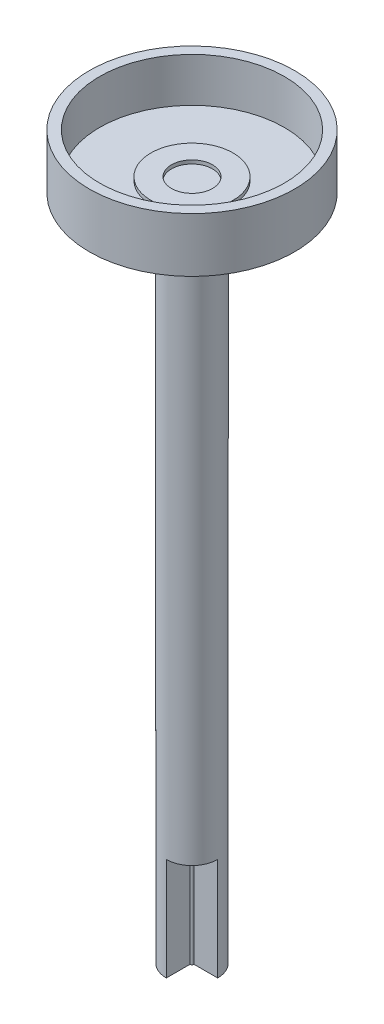
ISO-10303-21;
HEADER;
FILE_DESCRIPTION(('STEP AP214'),'2;1');
FILE_NAME('part.step','',(''),(''),'','','');
FILE_SCHEMA(('AUTOMOTIVE_DESIGN { 1 0 10303 214 1 1 1 1 }'));
ENDSEC;
DATA;
#1=APPLICATION_CONTEXT('core data for automotive mechanical design processes');
#2=APPLICATION_PROTOCOL_DEFINITION('international standard','automotive_design',2000,#1);
#3=PRODUCT_CONTEXT('',#1,'mechanical');
#4=PRODUCT('Part','Part','',(#3));
#5=PRODUCT_RELATED_PRODUCT_CATEGORY('part','',(#4));
#6=PRODUCT_DEFINITION_FORMATION('','',#4);
#7=PRODUCT_DEFINITION_CONTEXT('part definition',#1,'design');
#8=PRODUCT_DEFINITION('design','',#6,#7);
#9=PRODUCT_DEFINITION_SHAPE('','',#8);
#10=(LENGTH_UNIT() NAMED_UNIT(*) SI_UNIT(.MILLI.,.METRE.));
#11=(NAMED_UNIT(*) PLANE_ANGLE_UNIT() SI_UNIT($,.RADIAN.));
#12=(NAMED_UNIT(*) SI_UNIT($,.STERADIAN.) SOLID_ANGLE_UNIT());
#13=UNCERTAINTY_MEASURE_WITH_UNIT(LENGTH_MEASURE(1.E-05),#10,'distance_accuracy_value','');
#14=(GEOMETRIC_REPRESENTATION_CONTEXT(3) GLOBAL_UNCERTAINTY_ASSIGNED_CONTEXT((#13)) GLOBAL_UNIT_ASSIGNED_CONTEXT((#10,
#11,#12)) REPRESENTATION_CONTEXT('',''));
#15=CARTESIAN_POINT('',(0.,0.,0.));
#16=DIRECTION('',(0.,0.,1.));
#17=DIRECTION('',(1.,0.,0.));
#18=AXIS2_PLACEMENT_3D('',#15,#16,#17);
#19=CARTESIAN_POINT('',(0.,4.3,0.));
#20=DIRECTION('',(0.,1.,0.));
#21=DIRECTION('',(0.,0.,1.));
#22=AXIS2_PLACEMENT_3D('',#19,#20,#21);
#23=PLANE('',#22);
#24=CARTESIAN_POINT('',(0.,4.3,0.));
#25=DIRECTION('',(0.,1.,0.));
#26=DIRECTION('',(0.,0.,1.));
#27=AXIS2_PLACEMENT_3D('',#24,#25,#26);
#28=CIRCLE('',#27,10.);
#29=CARTESIAN_POINT('',(0.,4.3,-10.));
#30=VERTEX_POINT('',#29);
#31=EDGE_CURVE('E181',#30,#30,#28,.T.);
#32=ORIENTED_EDGE('',*,*,#31,.T.);
#33=EDGE_LOOP('',(#32));
#34=FACE_BOUND('',#33,.T.);
#35=CARTESIAN_POINT('',(0.,4.3,0.));
#36=DIRECTION('',(0.,1.,0.));
#37=DIRECTION('',(0.,0.,1.));
#38=AXIS2_PLACEMENT_3D('',#35,#36,#37);
#39=CIRCLE('',#38,9.);
#40=CARTESIAN_POINT('',(0.,4.3,-9.));
#41=VERTEX_POINT('',#40);
#42=EDGE_CURVE('E178',#41,#41,#39,.T.);
#43=ORIENTED_EDGE('',*,*,#42,.F.);
#44=EDGE_LOOP('',(#43));
#45=FACE_BOUND('',#44,.T.);
#46=ADVANCED_FACE('F38',(#34,#45),#23,.T.);
#47=CARTESIAN_POINT('',(0.,4.3,0.));
#48=DIRECTION('',(0.,-1.,0.));
#49=DIRECTION('',(0.,0.,-1.));
#50=AXIS2_PLACEMENT_3D('',#47,#48,#49);
#51=CYLINDRICAL_SURFACE('',#50,10.);
#52=CARTESIAN_POINT('',(0.,-1.,0.));
#53=DIRECTION('',(0.,1.,0.));
#54=DIRECTION('',(0.,0.,1.));
#55=AXIS2_PLACEMENT_3D('',#52,#53,#54);
#56=CIRCLE('',#55,10.);
#57=CARTESIAN_POINT('',(0.,-1.,-10.));
#58=VERTEX_POINT('',#57);
#59=EDGE_CURVE('E172',#58,#58,#56,.T.);
#60=CARTESIAN_POINT('',(0.,4.3,-10.));
#61=CARTESIAN_POINT('',(0.,4.24479166666667,-10.));
#62=CARTESIAN_POINT('',(0.,4.18958333333333,-10.));
#63=CARTESIAN_POINT('',(0.,4.07916666666667,-10.));
#64=CARTESIAN_POINT('',(0.,4.02395833333333,-10.));
#65=CARTESIAN_POINT('',(0.,3.91354166666667,-10.));
#66=CARTESIAN_POINT('',(0.,3.85833333333333,-10.));
#67=CARTESIAN_POINT('',(0.,3.74791666666667,-10.));
#68=CARTESIAN_POINT('',(0.,3.69270833333333,-10.));
#69=CARTESIAN_POINT('',(0.,3.58229166666667,-10.));
#70=CARTESIAN_POINT('',(0.,3.52708333333333,-10.));
#71=CARTESIAN_POINT('',(0.,3.41666666666667,-10.));
#72=CARTESIAN_POINT('',(0.,3.36145833333333,-10.));
#73=CARTESIAN_POINT('',(0.,3.25104166666667,-10.));
#74=CARTESIAN_POINT('',(0.,3.19583333333333,-10.));
#75=CARTESIAN_POINT('',(0.,3.08541666666667,-10.));
#76=CARTESIAN_POINT('',(0.,3.03020833333333,-10.));
#77=CARTESIAN_POINT('',(0.,2.91979166666667,-10.));
#78=CARTESIAN_POINT('',(0.,2.86458333333333,-10.));
#79=CARTESIAN_POINT('',(0.,2.75416666666667,-10.));
#80=CARTESIAN_POINT('',(0.,2.69895833333333,-10.));
#81=CARTESIAN_POINT('',(0.,2.58854166666667,-10.));
#82=CARTESIAN_POINT('',(0.,2.53333333333333,-10.));
#83=CARTESIAN_POINT('',(0.,2.42291666666667,-10.));
#84=CARTESIAN_POINT('',(0.,2.36770833333333,-10.));
#85=CARTESIAN_POINT('',(0.,2.25729166666667,-10.));
#86=CARTESIAN_POINT('',(0.,2.20208333333333,-10.));
#87=CARTESIAN_POINT('',(0.,2.09166666666667,-10.));
#88=CARTESIAN_POINT('',(0.,2.03645833333333,-10.));
#89=CARTESIAN_POINT('',(0.,1.92604166666667,-10.));
#90=CARTESIAN_POINT('',(0.,1.87083333333333,-10.));
#91=CARTESIAN_POINT('',(0.,1.76041666666667,-10.));
#92=CARTESIAN_POINT('',(0.,1.70520833333333,-10.));
#93=CARTESIAN_POINT('',(0.,1.59479166666667,-10.));
#94=CARTESIAN_POINT('',(0.,1.53958333333333,-10.));
#95=CARTESIAN_POINT('',(0.,1.42916666666667,-10.));
#96=CARTESIAN_POINT('',(0.,1.37395833333333,-10.));
#97=CARTESIAN_POINT('',(0.,1.26354166666667,-10.));
#98=CARTESIAN_POINT('',(0.,1.20833333333333,-10.));
#99=CARTESIAN_POINT('',(0.,1.09791666666667,-10.));
#100=CARTESIAN_POINT('',(0.,1.04270833333333,-10.));
#101=CARTESIAN_POINT('',(0.,0.932291666666666,-10.));
#102=CARTESIAN_POINT('',(0.,0.877083333333333,-10.));
#103=CARTESIAN_POINT('',(0.,0.766666666666666,-10.));
#104=CARTESIAN_POINT('',(0.,0.711458333333333,-10.));
#105=CARTESIAN_POINT('',(0.,0.601041666666666,-10.));
#106=CARTESIAN_POINT('',(0.,0.545833333333333,-10.));
#107=CARTESIAN_POINT('',(0.,0.435416666666666,-10.));
#108=CARTESIAN_POINT('',(0.,0.380208333333333,-10.));
#109=CARTESIAN_POINT('',(0.,0.269791666666666,-10.));
#110=CARTESIAN_POINT('',(0.,0.214583333333333,-10.));
#111=CARTESIAN_POINT('',(0.,0.104166666666666,-10.));
#112=CARTESIAN_POINT('',(0.,0.0489583333333331,-10.));
#113=CARTESIAN_POINT('',(0.,-0.0614583333333335,-10.));
#114=CARTESIAN_POINT('',(0.,-0.116666666666667,-10.));
#115=CARTESIAN_POINT('',(0.,-0.227083333333333,-10.));
#116=CARTESIAN_POINT('',(0.,-0.282291666666667,-10.));
#117=CARTESIAN_POINT('',(0.,-0.392708333333333,-10.));
#118=CARTESIAN_POINT('',(0.,-0.447916666666667,-10.));
#119=CARTESIAN_POINT('',(0.,-0.558333333333333,-10.));
#120=CARTESIAN_POINT('',(0.,-0.613541666666667,-10.));
#121=CARTESIAN_POINT('',(0.,-0.723958333333333,-10.));
#122=CARTESIAN_POINT('',(0.,-0.779166666666667,-10.));
#123=CARTESIAN_POINT('',(0.,-0.889583333333333,-10.));
#124=CARTESIAN_POINT('',(0.,-0.944791666666667,-10.));
#125=CARTESIAN_POINT('',(0.,-1.,-10.));
#126=B_SPLINE_CURVE_WITH_KNOTS('',3,(#60,#61,#62,#63,#64,#65,#66,#67,#68,#69,#70,#71,#72,#73,
#74,#75,#76,#77,#78,#79,#80,#81,#82,#83,#84,#85,#86,#87,#88,#89,#90,#91,#92,#93,#94,#95,#96,#97,
#98,#99,#100,#101,#102,#103,#104,#105,#106,#107,#108,#109,#110,#111,#112,#113,#114,#115,#116,
#117,#118,#119,#120,#121,#122,#123,#124,#125),.UNSPECIFIED.,.F.,.F.,(4,2,2,2,2,2,2,2,2,2,2,2,2,
2,2,2,2,2,2,2,2,2,2,2,2,2,2,2,2,2,2,2,4),(0.,0.165625000000001,0.331250000000001,0.496875,
0.6625,0.828125,0.993750000000001,1.159375,1.325,1.490625,1.65625,1.821875,1.9875,2.153125,
2.31875,2.484375,2.65,2.815625,2.98125,3.146875,3.3125,3.478125,3.64375,3.809375,3.975,4.140625,
4.30625,4.471875,4.6375,4.803125,4.96875,5.134375,5.3),.UNSPECIFIED.);
#127=EDGE_CURVE('BSEAM40',#30,#58,#126,.T.);
#128=ORIENTED_EDGE('',*,*,#31,.F.);
#129=ORIENTED_EDGE('',*,*,#59,.T.);
#130=ORIENTED_EDGE('',*,*,#127,.T.);
#131=ORIENTED_EDGE('',*,*,#127,.F.);
#132=EDGE_LOOP('',(#128,#130,#129,#131));
#133=FACE_BOUND('',#132,.T.);
#134=ADVANCED_FACE('F40',(#133),#51,.T.);
#135=CARTESIAN_POINT('',(0.,4.3,0.));
#136=DIRECTION('',(0.,-1.,0.));
#137=DIRECTION('',(0.,0.,-1.));
#138=AXIS2_PLACEMENT_3D('',#135,#136,#137);
#139=CYLINDRICAL_SURFACE('',#138,9.);
#140=CARTESIAN_POINT('',(0.,0.,0.));
#141=DIRECTION('',(0.,1.,0.));
#142=DIRECTION('',(0.,0.,1.));
#143=AXIS2_PLACEMENT_3D('',#140,#141,#142);
#144=CIRCLE('',#143,9.);
#145=CARTESIAN_POINT('',(0.,0.,-9.));
#146=VERTEX_POINT('',#145);
#147=EDGE_CURVE('E177',#146,#146,#144,.T.);
#148=CARTESIAN_POINT('',(0.,4.3,-9.));
#149=CARTESIAN_POINT('',(0.,4.25520833333333,-9.));
#150=CARTESIAN_POINT('',(0.,4.21041666666667,-9.));
#151=CARTESIAN_POINT('',(0.,4.12083333333333,-9.));
#152=CARTESIAN_POINT('',(0.,4.07604166666667,-9.));
#153=CARTESIAN_POINT('',(0.,3.98645833333333,-9.));
#154=CARTESIAN_POINT('',(0.,3.94166666666667,-9.));
#155=CARTESIAN_POINT('',(0.,3.85208333333333,-9.));
#156=CARTESIAN_POINT('',(0.,3.80729166666667,-9.));
#157=CARTESIAN_POINT('',(0.,3.71770833333333,-9.));
#158=CARTESIAN_POINT('',(0.,3.67291666666667,-9.));
#159=CARTESIAN_POINT('',(0.,3.58333333333333,-9.));
#160=CARTESIAN_POINT('',(0.,3.53854166666667,-9.));
#161=CARTESIAN_POINT('',(0.,3.44895833333333,-9.));
#162=CARTESIAN_POINT('',(0.,3.40416666666667,-9.));
#163=CARTESIAN_POINT('',(0.,3.31458333333333,-9.));
#164=CARTESIAN_POINT('',(0.,3.26979166666667,-9.));
#165=CARTESIAN_POINT('',(0.,3.18020833333333,-9.));
#166=CARTESIAN_POINT('',(0.,3.13541666666667,-9.));
#167=CARTESIAN_POINT('',(0.,3.04583333333333,-9.));
#168=CARTESIAN_POINT('',(0.,3.00104166666667,-9.));
#169=CARTESIAN_POINT('',(0.,2.91145833333333,-9.));
#170=CARTESIAN_POINT('',(0.,2.86666666666667,-9.));
#171=CARTESIAN_POINT('',(0.,2.77708333333333,-9.));
#172=CARTESIAN_POINT('',(0.,2.73229166666667,-9.));
#173=CARTESIAN_POINT('',(0.,2.64270833333333,-9.));
#174=CARTESIAN_POINT('',(0.,2.59791666666667,-9.));
#175=CARTESIAN_POINT('',(0.,2.50833333333333,-9.));
#176=CARTESIAN_POINT('',(0.,2.46354166666667,-9.));
#177=CARTESIAN_POINT('',(0.,2.37395833333333,-9.));
#178=CARTESIAN_POINT('',(0.,2.32916666666667,-9.));
#179=CARTESIAN_POINT('',(0.,2.23958333333333,-9.));
#180=CARTESIAN_POINT('',(0.,2.19479166666667,-9.));
#181=CARTESIAN_POINT('',(0.,2.10520833333333,-9.));
#182=CARTESIAN_POINT('',(0.,2.06041666666667,-9.));
#183=CARTESIAN_POINT('',(0.,1.97083333333333,-9.));
#184=CARTESIAN_POINT('',(0.,1.92604166666667,-9.));
#185=CARTESIAN_POINT('',(0.,1.83645833333333,-9.));
#186=CARTESIAN_POINT('',(0.,1.79166666666667,-9.));
#187=CARTESIAN_POINT('',(0.,1.70208333333333,-9.));
#188=CARTESIAN_POINT('',(0.,1.65729166666667,-9.));
#189=CARTESIAN_POINT('',(0.,1.56770833333333,-9.));
#190=CARTESIAN_POINT('',(0.,1.52291666666667,-9.));
#191=CARTESIAN_POINT('',(0.,1.43333333333333,-9.));
#192=CARTESIAN_POINT('',(0.,1.38854166666667,-9.));
#193=CARTESIAN_POINT('',(0.,1.29895833333333,-9.));
#194=CARTESIAN_POINT('',(0.,1.25416666666667,-9.));
#195=CARTESIAN_POINT('',(0.,1.16458333333333,-9.));
#196=CARTESIAN_POINT('',(0.,1.11979166666667,-9.));
#197=CARTESIAN_POINT('',(0.,1.03020833333333,-9.));
#198=CARTESIAN_POINT('',(0.,0.985416666666666,-9.));
#199=CARTESIAN_POINT('',(0.,0.895833333333333,-9.));
#200=CARTESIAN_POINT('',(0.,0.851041666666666,-9.));
#201=CARTESIAN_POINT('',(0.,0.761458333333333,-9.));
#202=CARTESIAN_POINT('',(0.,0.716666666666666,-9.));
#203=CARTESIAN_POINT('',(0.,0.627083333333333,-9.));
#204=CARTESIAN_POINT('',(0.,0.582291666666666,-9.));
#205=CARTESIAN_POINT('',(0.,0.492708333333333,-9.));
#206=CARTESIAN_POINT('',(0.,0.447916666666666,-9.));
#207=CARTESIAN_POINT('',(0.,0.358333333333333,-9.));
#208=CARTESIAN_POINT('',(0.,0.313541666666666,-9.));
#209=CARTESIAN_POINT('',(0.,0.223958333333332,-9.));
#210=CARTESIAN_POINT('',(0.,0.179166666666666,-9.));
#211=CARTESIAN_POINT('',(0.,0.0895833333333324,-9.));
#212=CARTESIAN_POINT('',(0.,0.0447916666666658,-9.));
#213=CARTESIAN_POINT('',(0.,0.,-9.));
#214=B_SPLINE_CURVE_WITH_KNOTS('',3,(#148,#149,#150,#151,#152,#153,#154,#155,#156,#157,#158,
#159,#160,#161,#162,#163,#164,#165,#166,#167,#168,#169,#170,#171,#172,#173,#174,#175,#176,#177,
#178,#179,#180,#181,#182,#183,#184,#185,#186,#187,#188,#189,#190,#191,#192,#193,#194,#195,#196,
#197,#198,#199,#200,#201,#202,#203,#204,#205,#206,#207,#208,#209,#210,#211,#212,#213),
.UNSPECIFIED.,.F.,.F.,(4,2,2,2,2,2,2,2,2,2,2,2,2,2,2,2,2,2,2,2,2,2,2,2,2,2,2,2,2,2,2,2,4),(0.,
0.134375,0.26875,0.403124999999999,0.5375,0.671875,0.80625,0.940625,1.075,1.209375,1.34375,
1.478125,1.6125,1.746875,1.88125,2.015625,2.15,2.284375,2.41875,2.553125,2.6875,2.821875,
2.95625,3.090625,3.225,3.359375,3.49375,3.628125,3.7625,3.896875,4.03125,4.165625,4.3),.UNSPECIFIED.);
#215=EDGE_CURVE('BSEAM208',#41,#146,#214,.T.);
#216=ORIENTED_EDGE('',*,*,#42,.T.);
#217=ORIENTED_EDGE('',*,*,#147,.F.);
#218=ORIENTED_EDGE('',*,*,#215,.T.);
#219=ORIENTED_EDGE('',*,*,#215,.F.);
#220=EDGE_LOOP('',(#216,#218,#217,#219));
#221=FACE_BOUND('',#220,.T.);
#222=ADVANCED_FACE('F208',(#221),#139,.F.);
#223=CARTESIAN_POINT('',(0.,0.,0.));
#224=DIRECTION('',(0.,1.,0.));
#225=DIRECTION('',(0.,0.,1.));
#226=AXIS2_PLACEMENT_3D('',#223,#224,#225);
#227=PLANE('',#226);
#228=CARTESIAN_POINT('',(0.,0.,0.));
#229=DIRECTION('',(0.,1.,0.));
#230=DIRECTION('',(1.,0.,0.));
#231=AXIS2_PLACEMENT_3D('',#228,#229,#230);
#232=CIRCLE('',#231,4.);
#233=CARTESIAN_POINT('',(4.,0.,0.));
#234=VERTEX_POINT('',#233);
#235=EDGE_CURVE('E168',#234,#234,#232,.T.);
#236=ORIENTED_EDGE('',*,*,#235,.F.);
#237=EDGE_LOOP('',(#236));
#238=FACE_BOUND('',#237,.T.);
#239=ORIENTED_EDGE('',*,*,#147,.T.);
#240=EDGE_LOOP('',(#239));
#241=FACE_BOUND('',#240,.T.);
#242=ADVANCED_FACE('F194',(#238,#241),#227,.T.);
#243=CARTESIAN_POINT('',(0.,-1.,0.));
#244=DIRECTION('',(0.,1.,0.));
#245=DIRECTION('',(0.,0.,1.));
#246=AXIS2_PLACEMENT_3D('',#243,#244,#245);
#247=PLANE('',#246);
#248=CARTESIAN_POINT('',(0.,-1.,0.));
#249=DIRECTION('',(0.,-1.,0.));
#250=DIRECTION('',(0.,0.,-1.));
#251=AXIS2_PLACEMENT_3D('',#248,#249,#250);
#252=CIRCLE('',#251,2.5);
#253=CARTESIAN_POINT('',(0.,-1.,-2.5));
#254=VERTEX_POINT('',#253);
#255=EDGE_CURVE('E12',#254,#254,#252,.T.);
#256=ORIENTED_EDGE('',*,*,#255,.F.);
#257=EDGE_LOOP('',(#256));
#258=FACE_BOUND('',#257,.T.);
#259=ORIENTED_EDGE('',*,*,#59,.F.);
#260=EDGE_LOOP('',(#259));
#261=FACE_BOUND('',#260,.T.);
#262=ADVANCED_FACE('F207',(#258,#261),#247,.F.);
#263=CARTESIAN_POINT('',(0.,0.35,0.));
#264=DIRECTION('',(0.,1.,0.));
#265=DIRECTION('',(0.,0.,1.));
#266=AXIS2_PLACEMENT_3D('',#263,#264,#265);
#267=PLANE('',#266);
#268=CARTESIAN_POINT('',(0.,0.35,0.));
#269=DIRECTION('',(0.,1.,0.));
#270=DIRECTION('',(1.,0.,0.));
#271=AXIS2_PLACEMENT_3D('',#268,#269,#270);
#272=CIRCLE('',#271,4.);
#273=CARTESIAN_POINT('',(4.,0.35,0.));
#274=VERTEX_POINT('',#273);
#275=EDGE_CURVE('E169',#274,#274,#272,.T.);
#276=ORIENTED_EDGE('',*,*,#275,.T.);
#277=EDGE_LOOP('',(#276));
#278=FACE_BOUND('',#277,.T.);
#279=CARTESIAN_POINT('',(0.,0.35,0.));
#280=DIRECTION('',(0.,1.,0.));
#281=DIRECTION('',(0.,0.,1.));
#282=AXIS2_PLACEMENT_3D('',#279,#280,#281);
#283=CIRCLE('',#282,2.);
#284=CARTESIAN_POINT('',(0.,0.35,2.));
#285=VERTEX_POINT('',#284);
#286=EDGE_CURVE('E164',#285,#285,#283,.T.);
#287=ORIENTED_EDGE('',*,*,#286,.F.);
#288=EDGE_LOOP('',(#287));
#289=FACE_BOUND('',#288,.T.);
#290=ADVANCED_FACE('F237',(#278,#289),#267,.T.);
#291=CARTESIAN_POINT('',(0.,0.35,0.));
#292=DIRECTION('',(0.,-1.,0.));
#293=DIRECTION('',(0.,0.,-1.));
#294=AXIS2_PLACEMENT_3D('',#291,#292,#293);
#295=CYLINDRICAL_SURFACE('',#294,4.);
#296=ORIENTED_EDGE('',*,*,#275,.F.);
#297=EDGE_LOOP('',(#296));
#298=FACE_BOUND('',#297,.T.);
#299=ORIENTED_EDGE('',*,*,#235,.T.);
#300=EDGE_LOOP('',(#299));
#301=FACE_BOUND('',#300,.T.);
#302=ADVANCED_FACE('F201',(#298,#301),#295,.T.);
#303=CARTESIAN_POINT('',(0.,0.35,0.));
#304=DIRECTION('',(0.,-1.,0.));
#305=DIRECTION('',(0.,0.,-1.));
#306=AXIS2_PLACEMENT_3D('',#303,#304,#305);
#307=CYLINDRICAL_SURFACE('',#306,2.);
#308=ORIENTED_EDGE('',*,*,#286,.T.);
#309=EDGE_LOOP('',(#308));
#310=FACE_BOUND('',#309,.T.);
#311=CARTESIAN_POINT('',(0.,0.,0.));
#312=DIRECTION('',(0.,1.,0.));
#313=DIRECTION('',(0.,0.,1.));
#314=AXIS2_PLACEMENT_3D('',#311,#312,#313);
#315=CIRCLE('',#314,2.);
#316=CARTESIAN_POINT('',(0.,0.,2.));
#317=VERTEX_POINT('',#316);
#318=EDGE_CURVE('E42',#317,#317,#315,.F.);
#319=ORIENTED_EDGE('',*,*,#318,.T.);
#320=EDGE_LOOP('',(#319));
#321=FACE_BOUND('',#320,.T.);
#322=ADVANCED_FACE('F189',(#310,#321),#307,.F.);
#323=ORIENTED_EDGE('',*,*,#318,.F.);
#324=EDGE_LOOP('',(#323));
#325=FACE_BOUND('',#324,.T.);
#326=ADVANCED_FACE('F191',(#325),#227,.T.);
#327=CARTESIAN_POINT('',(0.,-66.,0.));
#328=DIRECTION('',(0.,1.,0.));
#329=DIRECTION('',(0.,0.,1.));
#330=AXIS2_PLACEMENT_3D('',#327,#328,#329);
#331=CYLINDRICAL_SURFACE('',#330,2.5);
#332=CARTESIAN_POINT('',(0.,-56.,0.));
#333=DIRECTION('',(0.,-1.,0.));
#334=DIRECTION('',(0.,0.,-1.));
#335=AXIS2_PLACEMENT_3D('',#332,#333,#334);
#336=CIRCLE('',#335,2.5);
#337=CARTESIAN_POINT('',(2.5,-56.,0.));
#338=VERTEX_POINT('',#337);
#339=CARTESIAN_POINT('',(0.,-56.,2.5));
#340=VERTEX_POINT('',#339);
#341=EDGE_CURVE('E112',#338,#340,#336,.T.);
#342=ORIENTED_EDGE('',*,*,#341,.F.);
#343=DIRECTION('',(0.,-1.,0.));
#344=VECTOR('',#343,1.);
#345=CARTESIAN_POINT('',(2.5,-56.,0.));
#346=LINE('',#345,#344);
#347=CARTESIAN_POINT('',(2.5,-66.,0.));
#348=VERTEX_POINT('',#347);
#349=EDGE_CURVE('E151',#338,#348,#346,.T.);
#350=ORIENTED_EDGE('',*,*,#349,.T.);
#351=CARTESIAN_POINT('',(0.,-66.,0.));
#352=DIRECTION('',(0.,-1.,0.));
#353=DIRECTION('',(0.,0.,-1.));
#354=AXIS2_PLACEMENT_3D('',#351,#352,#353);
#355=CIRCLE('',#354,2.5);
#356=CARTESIAN_POINT('',(0.,-66.,-2.5));
#357=VERTEX_POINT('',#356);
#358=EDGE_CURVE('E162',#357,#348,#355,.T.);
#359=ORIENTED_EDGE('',*,*,#358,.F.);
#360=DIRECTION('',(0.,-1.,0.));
#361=VECTOR('',#360,1.);
#362=CARTESIAN_POINT('',(0.,-56.,-2.5));
#363=LINE('',#362,#361);
#364=CARTESIAN_POINT('',(0.,-56.,-2.5));
#365=VERTEX_POINT('',#364);
#366=EDGE_CURVE('E62',#365,#357,#363,.T.);
#367=ORIENTED_EDGE('',*,*,#366,.F.);
#368=CARTESIAN_POINT('',(0.,-56.,0.));
#369=DIRECTION('',(0.,-1.,0.));
#370=DIRECTION('',(0.,0.,-1.));
#371=AXIS2_PLACEMENT_3D('',#368,#369,#370);
#372=CIRCLE('',#371,2.5);
#373=CARTESIAN_POINT('',(-2.5,-56.,0.));
#374=VERTEX_POINT('',#373);
#375=EDGE_CURVE('E135',#374,#365,#372,.T.);
#376=ORIENTED_EDGE('',*,*,#375,.F.);
#377=DIRECTION('',(0.,-1.,0.));
#378=VECTOR('',#377,1.);
#379=CARTESIAN_POINT('',(-2.5,-56.,0.));
#380=LINE('',#379,#378);
#381=CARTESIAN_POINT('',(-2.5,-66.,0.));
#382=VERTEX_POINT('',#381);
#383=EDGE_CURVE('E155',#374,#382,#380,.T.);
#384=ORIENTED_EDGE('',*,*,#383,.T.);
#385=CARTESIAN_POINT('',(0.,-66.,2.5));
#386=VERTEX_POINT('',#385);
#387=EDGE_CURVE('E128',#386,#382,#355,.T.);
#388=ORIENTED_EDGE('',*,*,#387,.F.);
#389=DIRECTION('',(0.,-1.,0.));
#390=VECTOR('',#389,1.);
#391=CARTESIAN_POINT('',(0.,-56.,2.5));
#392=LINE('',#391,#390);
#393=EDGE_CURVE('E54',#340,#386,#392,.T.);
#394=ORIENTED_EDGE('',*,*,#393,.F.);
#395=EDGE_LOOP('',(#342,#350,#359,#367,#376,#384,#388,#394));
#396=FACE_BOUND('',#395,.T.);
#397=ORIENTED_EDGE('',*,*,#255,.T.);
#398=EDGE_LOOP('',(#397));
#399=FACE_BOUND('',#398,.T.);
#400=ADVANCED_FACE('F124',(#396,#399),#331,.T.);
#401=CARTESIAN_POINT('',(0.,-66.,0.));
#402=DIRECTION('',(0.,-1.,0.));
#403=DIRECTION('',(0.,0.,-1.));
#404=AXIS2_PLACEMENT_3D('',#401,#402,#403);
#405=PLANE('',#404);
#406=DIRECTION('',(1.,0.,0.));
#407=VECTOR('',#406,1.);
#408=CARTESIAN_POINT('',(0.194982329167258,-66.,0.));
#409=LINE('',#408,#407);
#410=CARTESIAN_POINT('',(0.194982329167258,-66.,0.));
#411=VERTEX_POINT('',#410);
#412=EDGE_CURVE('E121',#411,#348,#409,.T.);
#413=ORIENTED_EDGE('',*,*,#412,.F.);
#414=CARTESIAN_POINT('',(0.,-66.,0.));
#415=DIRECTION('',(0.,1.,0.));
#416=DIRECTION('',(0.,0.,-1.));
#417=AXIS2_PLACEMENT_3D('',#414,#415,#416);
#418=CIRCLE('',#417,0.194982329167258);
#419=CARTESIAN_POINT('',(0.,-66.,0.194982329167258));
#420=VERTEX_POINT('',#419);
#421=EDGE_CURVE('E376',#420,#411,#418,.T.);
#422=ORIENTED_EDGE('',*,*,#421,.F.);
#423=DIRECTION('',(0.,0.,-1.));
#424=VECTOR('',#423,1.);
#425=CARTESIAN_POINT('',(0.,-66.,2.5));
#426=LINE('',#425,#424);
#427=EDGE_CURVE('E378',#386,#420,#426,.T.);
#428=ORIENTED_EDGE('',*,*,#427,.F.);
#429=ORIENTED_EDGE('',*,*,#387,.T.);
#430=DIRECTION('',(-1.,0.,0.));
#431=VECTOR('',#430,1.);
#432=CARTESIAN_POINT('',(-2.5,-66.,0.));
#433=LINE('',#432,#431);
#434=CARTESIAN_POINT('',(-0.194982329167258,-66.,0.));
#435=VERTEX_POINT('',#434);
#436=EDGE_CURVE('E139',#435,#382,#433,.T.);
#437=ORIENTED_EDGE('',*,*,#436,.F.);
#438=CARTESIAN_POINT('',(0.,-66.,0.));
#439=DIRECTION('',(0.,1.,0.));
#440=DIRECTION('',(0.,0.,-1.));
#441=AXIS2_PLACEMENT_3D('',#438,#439,#440);
#442=CIRCLE('',#441,0.194982329167258);
#443=CARTESIAN_POINT('',(0.,-66.,-0.194982329167258));
#444=VERTEX_POINT('',#443);
#445=EDGE_CURVE('E150',#444,#435,#442,.T.);
#446=ORIENTED_EDGE('',*,*,#445,.F.);
#447=DIRECTION('',(0.,0.,1.));
#448=VECTOR('',#447,1.);
#449=CARTESIAN_POINT('',(0.,-66.,-0.194982329167258));
#450=LINE('',#449,#448);
#451=EDGE_CURVE('E148',#357,#444,#450,.T.);
#452=ORIENTED_EDGE('',*,*,#451,.F.);
#453=ORIENTED_EDGE('',*,*,#358,.T.);
#454=EDGE_LOOP('',(#413,#422,#428,#429,#437,#446,#452,#453));
#455=FACE_BOUND('',#454,.T.);
#456=ADVANCED_FACE('F199',(#455),#405,.T.);
#457=CARTESIAN_POINT('',(-2.5,-56.,0.));
#458=DIRECTION('',(0.,0.,1.));
#459=DIRECTION('',(1.,0.,0.));
#460=AXIS2_PLACEMENT_3D('',#457,#458,#459);
#461=PLANE('',#460);
#462=ORIENTED_EDGE('',*,*,#436,.T.);
#463=ORIENTED_EDGE('',*,*,#383,.F.);
#464=DIRECTION('',(-1.,0.,0.));
#465=VECTOR('',#464,1.);
#466=CARTESIAN_POINT('',(-2.5,-56.,0.));
#467=LINE('',#466,#465);
#468=CARTESIAN_POINT('',(-0.194982329167258,-56.,0.));
#469=VERTEX_POINT('',#468);
#470=EDGE_CURVE('E145',#469,#374,#467,.T.);
#471=ORIENTED_EDGE('',*,*,#470,.F.);
#472=DIRECTION('',(0.,-1.,0.));
#473=VECTOR('',#472,1.);
#474=CARTESIAN_POINT('',(-0.194982329167258,-56.,0.));
#475=LINE('',#474,#473);
#476=EDGE_CURVE('E157',#469,#435,#475,.T.);
#477=ORIENTED_EDGE('',*,*,#476,.T.);
#478=EDGE_LOOP('',(#462,#463,#471,#477));
#479=FACE_BOUND('',#478,.T.);
#480=ADVANCED_FACE('F295',(#479),#461,.F.);
#481=CARTESIAN_POINT('',(0.,-56.,0.));
#482=DIRECTION('',(0.,-1.,0.));
#483=DIRECTION('',(0.,0.,-1.));
#484=AXIS2_PLACEMENT_3D('',#481,#482,#483);
#485=CYLINDRICAL_SURFACE('',#484,0.194982329167258);
#486=ORIENTED_EDGE('',*,*,#445,.T.);
#487=ORIENTED_EDGE('',*,*,#476,.F.);
#488=CARTESIAN_POINT('',(0.,-56.,0.));
#489=DIRECTION('',(0.,1.,0.));
#490=DIRECTION('',(0.,0.,-1.));
#491=AXIS2_PLACEMENT_3D('',#488,#489,#490);
#492=CIRCLE('',#491,0.194982329167258);
#493=CARTESIAN_POINT('',(0.,-56.,-0.194982329167258));
#494=VERTEX_POINT('',#493);
#495=EDGE_CURVE('E142',#494,#469,#492,.T.);
#496=ORIENTED_EDGE('',*,*,#495,.F.);
#497=DIRECTION('',(0.,-1.,0.));
#498=VECTOR('',#497,1.);
#499=CARTESIAN_POINT('',(0.,-56.,-0.194982329167258));
#500=LINE('',#499,#498);
#501=EDGE_CURVE('E159',#494,#444,#500,.T.);
#502=ORIENTED_EDGE('',*,*,#501,.T.);
#503=EDGE_LOOP('',(#486,#487,#496,#502));
#504=FACE_BOUND('',#503,.T.);
#505=ADVANCED_FACE('F304',(#504),#485,.T.);
#506=CARTESIAN_POINT('',(0.,-56.,-0.194982329167258));
#507=DIRECTION('',(1.,0.,0.));
#508=DIRECTION('',(0.,0.,-1.));
#509=AXIS2_PLACEMENT_3D('',#506,#507,#508);
#510=PLANE('',#509);
#511=ORIENTED_EDGE('',*,*,#451,.T.);
#512=ORIENTED_EDGE('',*,*,#501,.F.);
#513=DIRECTION('',(0.,0.,1.));
#514=VECTOR('',#513,1.);
#515=CARTESIAN_POINT('',(0.,-56.,-0.194982329167258));
#516=LINE('',#515,#514);
#517=EDGE_CURVE('E138',#365,#494,#516,.T.);
#518=ORIENTED_EDGE('',*,*,#517,.F.);
#519=ORIENTED_EDGE('',*,*,#366,.T.);
#520=EDGE_LOOP('',(#511,#512,#518,#519));
#521=FACE_BOUND('',#520,.T.);
#522=ADVANCED_FACE('F313',(#521),#510,.F.);
#523=CARTESIAN_POINT('',(0.,-56.,0.));
#524=DIRECTION('',(0.,-1.,0.));
#525=DIRECTION('',(0.,0.,-1.));
#526=AXIS2_PLACEMENT_3D('',#523,#524,#525);
#527=PLANE('',#526);
#528=ORIENTED_EDGE('',*,*,#375,.T.);
#529=ORIENTED_EDGE('',*,*,#517,.T.);
#530=ORIENTED_EDGE('',*,*,#495,.T.);
#531=ORIENTED_EDGE('',*,*,#470,.T.);
#532=EDGE_LOOP('',(#528,#529,#530,#531));
#533=FACE_BOUND('',#532,.T.);
#534=ADVANCED_FACE('F322',(#533),#527,.T.);
#535=CARTESIAN_POINT('',(0.194982329167258,-56.,0.));
#536=DIRECTION('',(0.,0.,-1.));
#537=DIRECTION('',(-1.,0.,0.));
#538=AXIS2_PLACEMENT_3D('',#535,#536,#537);
#539=PLANE('',#538);
#540=ORIENTED_EDGE('',*,*,#412,.T.);
#541=ORIENTED_EDGE('',*,*,#349,.F.);
#542=DIRECTION('',(1.,0.,0.));
#543=VECTOR('',#542,1.);
#544=CARTESIAN_POINT('',(0.194982329167258,-56.,0.));
#545=LINE('',#544,#543);
#546=CARTESIAN_POINT('',(0.194982329167258,-56.,0.));
#547=VERTEX_POINT('',#546);
#548=EDGE_CURVE('E118',#547,#338,#545,.T.);
#549=ORIENTED_EDGE('',*,*,#548,.F.);
#550=DIRECTION('',(0.,-1.,0.));
#551=VECTOR('',#550,1.);
#552=CARTESIAN_POINT('',(0.194982329167258,-56.,0.));
#553=LINE('',#552,#551);
#554=EDGE_CURVE('E130',#547,#411,#553,.T.);
#555=ORIENTED_EDGE('',*,*,#554,.T.);
#556=EDGE_LOOP('',(#540,#541,#549,#555));
#557=FACE_BOUND('',#556,.T.);
#558=ADVANCED_FACE('F330',(#557),#539,.F.);
#559=CARTESIAN_POINT('',(0.,-56.,0.));
#560=DIRECTION('',(0.,-1.,0.));
#561=DIRECTION('',(0.,0.,-1.));
#562=AXIS2_PLACEMENT_3D('',#559,#560,#561);
#563=CYLINDRICAL_SURFACE('',#562,0.194982329167258);
#564=ORIENTED_EDGE('',*,*,#421,.T.);
#565=ORIENTED_EDGE('',*,*,#554,.F.);
#566=CARTESIAN_POINT('',(0.,-56.,0.));
#567=DIRECTION('',(0.,1.,0.));
#568=DIRECTION('',(0.,0.,-1.));
#569=AXIS2_PLACEMENT_3D('',#566,#567,#568);
#570=CIRCLE('',#569,0.194982329167258);
#571=CARTESIAN_POINT('',(0.,-56.,0.194982329167258));
#572=VERTEX_POINT('',#571);
#573=EDGE_CURVE('E111',#572,#547,#570,.T.);
#574=ORIENTED_EDGE('',*,*,#573,.F.);
#575=DIRECTION('',(0.,-1.,0.));
#576=VECTOR('',#575,1.);
#577=CARTESIAN_POINT('',(0.,-56.,0.194982329167258));
#578=LINE('',#577,#576);
#579=EDGE_CURVE('E107',#572,#420,#578,.T.);
#580=ORIENTED_EDGE('',*,*,#579,.T.);
#581=EDGE_LOOP('',(#564,#565,#574,#580));
#582=FACE_BOUND('',#581,.T.);
#583=ADVANCED_FACE('F339',(#582),#563,.T.);
#584=CARTESIAN_POINT('',(0.,-56.,2.5));
#585=DIRECTION('',(-1.,0.,0.));
#586=DIRECTION('',(0.,0.,1.));
#587=AXIS2_PLACEMENT_3D('',#584,#585,#586);
#588=PLANE('',#587);
#589=ORIENTED_EDGE('',*,*,#427,.T.);
#590=ORIENTED_EDGE('',*,*,#579,.F.);
#591=DIRECTION('',(0.,0.,-1.));
#592=VECTOR('',#591,1.);
#593=CARTESIAN_POINT('',(0.,-56.,2.5));
#594=LINE('',#593,#592);
#595=EDGE_CURVE('E104',#340,#572,#594,.T.);
#596=ORIENTED_EDGE('',*,*,#595,.F.);
#597=ORIENTED_EDGE('',*,*,#393,.T.);
#598=EDGE_LOOP('',(#589,#590,#596,#597));
#599=FACE_BOUND('',#598,.T.);
#600=ADVANCED_FACE('F106',(#599),#588,.F.);
#601=CARTESIAN_POINT('',(0.,-56.,0.));
#602=DIRECTION('',(0.,-1.,0.));
#603=DIRECTION('',(0.,0.,-1.));
#604=AXIS2_PLACEMENT_3D('',#601,#602,#603);
#605=PLANE('',#604);
#606=ORIENTED_EDGE('',*,*,#341,.T.);
#607=ORIENTED_EDGE('',*,*,#595,.T.);
#608=ORIENTED_EDGE('',*,*,#573,.T.);
#609=ORIENTED_EDGE('',*,*,#548,.T.);
#610=EDGE_LOOP('',(#606,#607,#608,#609));
#611=FACE_BOUND('',#610,.T.);
#612=ADVANCED_FACE('F116',(#611),#605,.T.);
#613=CLOSED_SHELL('',(#46,#134,#222,#242,#262,#290,#302,#322,#326,#400,#456,#480,#505,#522,#534,
#558,#583,#600,#612));
#614=MANIFOLD_SOLID_BREP('B2',#613);
#615=ADVANCED_BREP_SHAPE_REPRESENTATION('',(#18,#614),#14);
#616=SHAPE_DEFINITION_REPRESENTATION(#9,#615);
ENDSEC;
END-ISO-10303-21;
